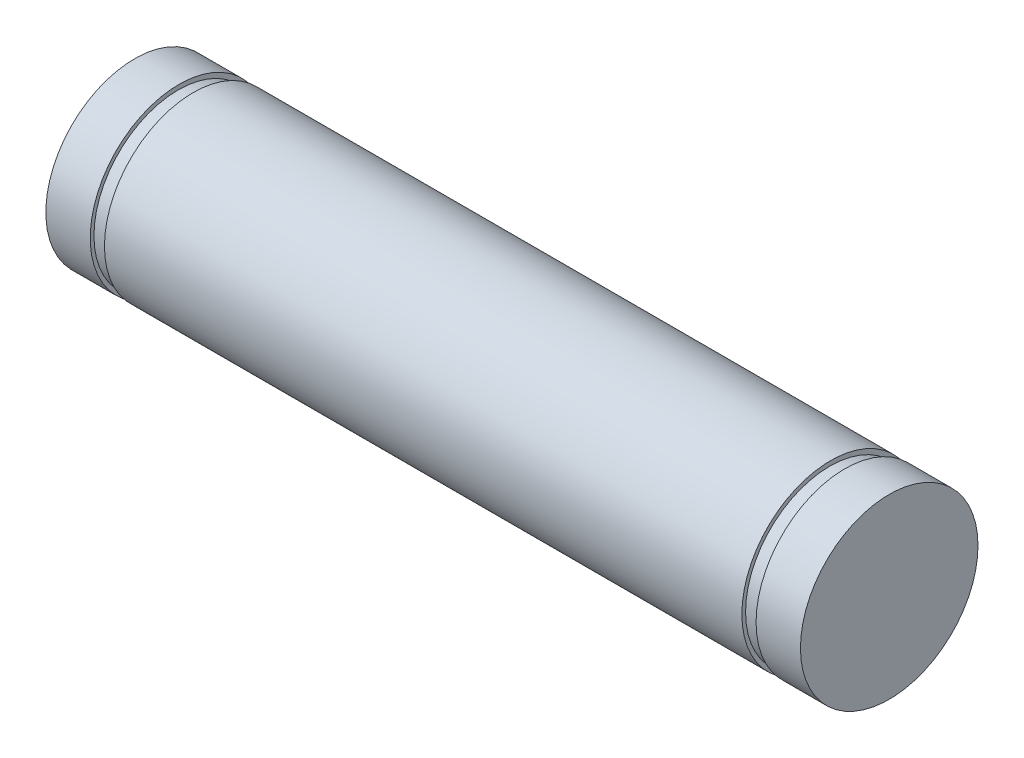
ISO-10303-21;
HEADER;
FILE_DESCRIPTION(('STEP AP214'),'2;1');
FILE_NAME('part.step','',(''),(''),'','','');
FILE_SCHEMA(('AUTOMOTIVE_DESIGN { 1 0 10303 214 1 1 1 1 }'));
ENDSEC;
DATA;
#1=APPLICATION_CONTEXT('core data for automotive mechanical design processes');
#2=APPLICATION_PROTOCOL_DEFINITION('international standard','automotive_design',2000,#1);
#3=PRODUCT_CONTEXT('',#1,'mechanical');
#4=PRODUCT('Part','Part','',(#3));
#5=PRODUCT_RELATED_PRODUCT_CATEGORY('part','',(#4));
#6=PRODUCT_DEFINITION_FORMATION('','',#4);
#7=PRODUCT_DEFINITION_CONTEXT('part definition',#1,'design');
#8=PRODUCT_DEFINITION('design','',#6,#7);
#9=PRODUCT_DEFINITION_SHAPE('','',#8);
#10=(LENGTH_UNIT() NAMED_UNIT(*) SI_UNIT(.MILLI.,.METRE.));
#11=(NAMED_UNIT(*) PLANE_ANGLE_UNIT() SI_UNIT($,.RADIAN.));
#12=(NAMED_UNIT(*) SI_UNIT($,.STERADIAN.) SOLID_ANGLE_UNIT());
#13=UNCERTAINTY_MEASURE_WITH_UNIT(LENGTH_MEASURE(1.E-05),#10,'distance_accuracy_value','');
#14=(GEOMETRIC_REPRESENTATION_CONTEXT(3) GLOBAL_UNCERTAINTY_ASSIGNED_CONTEXT((#13)) GLOBAL_UNIT_ASSIGNED_CONTEXT((#10,
#11,#12)) REPRESENTATION_CONTEXT('',''));
#15=CARTESIAN_POINT('',(0.,0.,0.));
#16=DIRECTION('',(0.,0.,1.));
#17=DIRECTION('',(1.,0.,0.));
#18=AXIS2_PLACEMENT_3D('',#15,#16,#17);
#19=CARTESIAN_POINT('',(17.,0.,0.));
#20=DIRECTION('',(-1.,0.,0.));
#21=DIRECTION('',(0.,0.,1.));
#22=AXIS2_PLACEMENT_3D('',#19,#20,#21);
#23=CYLINDRICAL_SURFACE('',#22,2.);
#24=CARTESIAN_POINT('',(15.68,0.,0.));
#25=DIRECTION('',(1.,0.,0.));
#26=DIRECTION('',(0.,0.,-1.));
#27=AXIS2_PLACEMENT_3D('',#24,#25,#26);
#28=CIRCLE('',#27,2.);
#29=CARTESIAN_POINT('',(15.68,0.,-2.));
#30=VERTEX_POINT('',#29);
#31=EDGE_CURVE('E49',#30,#30,#28,.T.);
#32=ORIENTED_EDGE('',*,*,#31,.F.);
#33=EDGE_LOOP('',(#32));
#34=FACE_BOUND('',#33,.T.);
#35=CARTESIAN_POINT('',(1.32,0.,0.));
#36=DIRECTION('',(-1.,0.,0.));
#37=DIRECTION('',(0.,0.,1.));
#38=AXIS2_PLACEMENT_3D('',#35,#36,#37);
#39=CIRCLE('',#38,2.);
#40=CARTESIAN_POINT('',(1.32,0.,2.00000000000001));
#41=VERTEX_POINT('',#40);
#42=EDGE_CURVE('E34',#41,#41,#39,.T.);
#43=ORIENTED_EDGE('',*,*,#42,.F.);
#44=EDGE_LOOP('',(#43));
#45=FACE_BOUND('',#44,.T.);
#46=ADVANCED_FACE('F30',(#34,#45),#23,.T.);
#47=CARTESIAN_POINT('',(17.,0.,0.));
#48=DIRECTION('',(1.,0.,0.));
#49=DIRECTION('',(0.,0.,-1.));
#50=AXIS2_PLACEMENT_3D('',#47,#48,#49);
#51=CIRCLE('',#50,2.);
#52=CARTESIAN_POINT('',(17.,0.,-2.));
#53=VERTEX_POINT('',#52);
#54=EDGE_CURVE('E10',#53,#53,#51,.T.);
#55=ORIENTED_EDGE('',*,*,#54,.F.);
#56=EDGE_LOOP('',(#55));
#57=FACE_BOUND('',#56,.T.);
#58=CARTESIAN_POINT('',(16.,0.,0.));
#59=DIRECTION('',(-1.,0.,0.));
#60=DIRECTION('',(0.,0.,1.));
#61=AXIS2_PLACEMENT_3D('',#58,#59,#60);
#62=CIRCLE('',#61,2.);
#63=CARTESIAN_POINT('',(16.,0.,2.00000000000001));
#64=VERTEX_POINT('',#63);
#65=EDGE_CURVE('E43',#64,#64,#62,.T.);
#66=ORIENTED_EDGE('',*,*,#65,.F.);
#67=EDGE_LOOP('',(#66));
#68=FACE_BOUND('',#67,.T.);
#69=ADVANCED_FACE('F32',(#57,#68),#23,.T.);
#70=CARTESIAN_POINT('',(17.,0.,0.));
#71=DIRECTION('',(1.,0.,0.));
#72=DIRECTION('',(0.,0.,-1.));
#73=AXIS2_PLACEMENT_3D('',#70,#71,#72);
#74=PLANE('',#73);
#75=ORIENTED_EDGE('',*,*,#54,.T.);
#76=EDGE_LOOP('',(#75));
#77=FACE_BOUND('',#76,.T.);
#78=ADVANCED_FACE('F80',(#77),#74,.T.);
#79=CARTESIAN_POINT('',(16.,0.,1.91649544327666));
#80=DIRECTION('',(-1.,0.,0.));
#81=DIRECTION('',(0.,0.,1.));
#82=AXIS2_PLACEMENT_3D('',#79,#80,#81);
#83=PLANE('',#82);
#84=CARTESIAN_POINT('',(16.,0.,0.0164954432766463));
#85=DIRECTION('',(-1.,0.,0.));
#86=DIRECTION('',(0.,0.,1.));
#87=AXIS2_PLACEMENT_3D('',#84,#85,#86);
#88=CIRCLE('',#87,1.90000000000001);
#89=CARTESIAN_POINT('',(16.,0.,1.91649544327665));
#90=VERTEX_POINT('',#89);
#91=EDGE_CURVE('E46',#90,#90,#88,.T.);
#92=ORIENTED_EDGE('',*,*,#91,.F.);
#93=EDGE_LOOP('',(#92));
#94=FACE_BOUND('',#93,.T.);
#95=ORIENTED_EDGE('',*,*,#65,.T.);
#96=EDGE_LOOP('',(#95));
#97=FACE_BOUND('',#96,.T.);
#98=ADVANCED_FACE('F76',(#94,#97),#83,.T.);
#99=CARTESIAN_POINT('',(15.68,0.,2.39999999999996));
#100=DIRECTION('',(1.,0.,0.));
#101=DIRECTION('',(0.,0.,-1.));
#102=AXIS2_PLACEMENT_3D('',#99,#100,#101);
#103=PLANE('',#102);
#104=CARTESIAN_POINT('',(15.68,0.,0.0164954432766463));
#105=DIRECTION('',(-1.,0.,0.));
#106=DIRECTION('',(0.,0.,1.));
#107=AXIS2_PLACEMENT_3D('',#104,#105,#106);
#108=CIRCLE('',#107,1.90000000000001);
#109=CARTESIAN_POINT('',(15.68,0.,1.91649544327665));
#110=VERTEX_POINT('',#109);
#111=EDGE_CURVE('E59',#110,#110,#108,.T.);
#112=ORIENTED_EDGE('',*,*,#111,.T.);
#113=EDGE_LOOP('',(#112));
#114=FACE_BOUND('',#113,.T.);
#115=ORIENTED_EDGE('',*,*,#31,.T.);
#116=EDGE_LOOP('',(#115));
#117=FACE_BOUND('',#116,.T.);
#118=ADVANCED_FACE('F79',(#114,#117),#103,.T.);
#119=CARTESIAN_POINT('',(67.7497499368518,0.,0.0164954432766463));
#120=DIRECTION('',(-1.,0.,0.));
#121=DIRECTION('',(0.,0.,1.));
#122=AXIS2_PLACEMENT_3D('',#119,#120,#121);
#123=CYLINDRICAL_SURFACE('',#122,1.90000000000001);
#124=ORIENTED_EDGE('',*,*,#91,.T.);
#125=EDGE_LOOP('',(#124));
#126=FACE_BOUND('',#125,.T.);
#127=ORIENTED_EDGE('',*,*,#111,.F.);
#128=EDGE_LOOP('',(#127));
#129=FACE_BOUND('',#128,.T.);
#130=ADVANCED_FACE('F73',(#126,#129),#123,.T.);
#131=CARTESIAN_POINT('',(1.32000000000004,0.,1.91649544327671));
#132=DIRECTION('',(-1.,0.,0.));
#133=DIRECTION('',(0.,0.,1.));
#134=AXIS2_PLACEMENT_3D('',#131,#132,#133);
#135=PLANE('',#134);
#136=CARTESIAN_POINT('',(1.32,0.,0.0164954432766984));
#137=DIRECTION('',(-1.,0.,0.));
#138=DIRECTION('',(0.,0.,1.));
#139=AXIS2_PLACEMENT_3D('',#136,#137,#138);
#140=CIRCLE('',#139,1.90000000000001);
#141=CARTESIAN_POINT('',(1.32,0.,1.91649544327671));
#142=VERTEX_POINT('',#141);
#143=EDGE_CURVE('E55',#142,#142,#140,.T.);
#144=ORIENTED_EDGE('',*,*,#143,.F.);
#145=EDGE_LOOP('',(#144));
#146=FACE_BOUND('',#145,.T.);
#147=ORIENTED_EDGE('',*,*,#42,.T.);
#148=EDGE_LOOP('',(#147));
#149=FACE_BOUND('',#148,.T.);
#150=ADVANCED_FACE('F110',(#146,#149),#135,.T.);
#151=CARTESIAN_POINT('',(1.00000000000004,0.,1.91649544327671));
#152=DIRECTION('',(1.,0.,0.));
#153=DIRECTION('',(0.,0.,-1.));
#154=AXIS2_PLACEMENT_3D('',#151,#152,#153);
#155=PLANE('',#154);
#156=CARTESIAN_POINT('',(1.,0.,0.0164954432766984));
#157=DIRECTION('',(-1.,0.,0.));
#158=DIRECTION('',(0.,0.,1.));
#159=AXIS2_PLACEMENT_3D('',#156,#157,#158);
#160=CIRCLE('',#159,1.90000000000001);
#161=CARTESIAN_POINT('',(1.,0.,1.91649544327671));
#162=VERTEX_POINT('',#161);
#163=EDGE_CURVE('E61',#162,#162,#160,.T.);
#164=ORIENTED_EDGE('',*,*,#163,.T.);
#165=EDGE_LOOP('',(#164));
#166=FACE_BOUND('',#165,.T.);
#167=CARTESIAN_POINT('',(1.,0.,0.));
#168=DIRECTION('',(1.,0.,0.));
#169=DIRECTION('',(0.,0.,-1.));
#170=AXIS2_PLACEMENT_3D('',#167,#168,#169);
#171=CIRCLE('',#170,2.);
#172=CARTESIAN_POINT('',(1.,0.,-2.));
#173=VERTEX_POINT('',#172);
#174=EDGE_CURVE('E53',#173,#173,#171,.T.);
#175=ORIENTED_EDGE('',*,*,#174,.T.);
#176=EDGE_LOOP('',(#175));
#177=FACE_BOUND('',#176,.T.);
#178=ADVANCED_FACE('F106',(#166,#177),#155,.T.);
#179=CARTESIAN_POINT('',(67.7497499368518,0.,0.0164954432766463));
#180=DIRECTION('',(-1.,0.,0.));
#181=DIRECTION('',(0.,0.,1.));
#182=AXIS2_PLACEMENT_3D('',#179,#180,#181);
#183=CYLINDRICAL_SURFACE('',#182,1.90000000000001);
#184=ORIENTED_EDGE('',*,*,#143,.T.);
#185=EDGE_LOOP('',(#184));
#186=FACE_BOUND('',#185,.T.);
#187=ORIENTED_EDGE('',*,*,#163,.F.);
#188=EDGE_LOOP('',(#187));
#189=FACE_BOUND('',#188,.T.);
#190=ADVANCED_FACE('F99',(#186,#189),#183,.T.);
#191=CARTESIAN_POINT('',(0.,0.,0.));
#192=DIRECTION('',(1.,0.,0.));
#193=DIRECTION('',(0.,0.,-1.));
#194=AXIS2_PLACEMENT_3D('',#191,#192,#193);
#195=PLANE('',#194);
#196=CARTESIAN_POINT('',(0.,0.,0.));
#197=DIRECTION('',(1.,0.,0.));
#198=DIRECTION('',(0.,0.,-1.));
#199=AXIS2_PLACEMENT_3D('',#196,#197,#198);
#200=CIRCLE('',#199,2.);
#201=CARTESIAN_POINT('',(0.,0.,-2.));
#202=VERTEX_POINT('',#201);
#203=EDGE_CURVE('E38',#202,#202,#200,.T.);
#204=ORIENTED_EDGE('',*,*,#203,.F.);
#205=EDGE_LOOP('',(#204));
#206=FACE_BOUND('',#205,.T.);
#207=ADVANCED_FACE('F94',(#206),#195,.F.);
#208=ORIENTED_EDGE('',*,*,#203,.T.);
#209=EDGE_LOOP('',(#208));
#210=FACE_BOUND('',#209,.T.);
#211=ORIENTED_EDGE('',*,*,#174,.F.);
#212=EDGE_LOOP('',(#211));
#213=FACE_BOUND('',#212,.T.);
#214=ADVANCED_FACE('F86',(#210,#213),#23,.T.);
#215=CLOSED_SHELL('',(#46,#69,#78,#98,#118,#130,#150,#178,#190,#207,#214));
#216=MANIFOLD_SOLID_BREP('B2',#215);
#217=ADVANCED_BREP_SHAPE_REPRESENTATION('',(#18,#216),#14);
#218=SHAPE_DEFINITION_REPRESENTATION(#9,#217);
ENDSEC;
END-ISO-10303-21;
